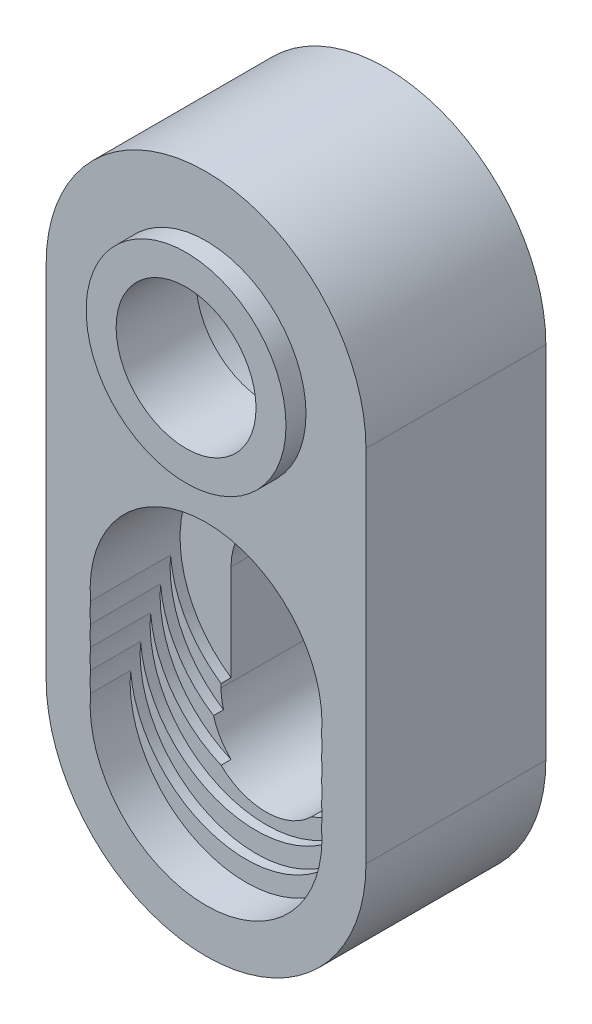
ISO-10303-21;
HEADER;
FILE_DESCRIPTION(('STEP AP214'),'2;1');
FILE_NAME('part.step','',(''),(''),'','','');
FILE_SCHEMA(('AUTOMOTIVE_DESIGN { 1 0 10303 214 1 1 1 1 }'));
ENDSEC;
DATA;
#1=APPLICATION_CONTEXT('core data for automotive mechanical design processes');
#2=APPLICATION_PROTOCOL_DEFINITION('international standard','automotive_design',2000,#1);
#3=PRODUCT_CONTEXT('',#1,'mechanical');
#4=PRODUCT('Part','Part','',(#3));
#5=PRODUCT_RELATED_PRODUCT_CATEGORY('part','',(#4));
#6=PRODUCT_DEFINITION_FORMATION('','',#4);
#7=PRODUCT_DEFINITION_CONTEXT('part definition',#1,'design');
#8=PRODUCT_DEFINITION('design','',#6,#7);
#9=PRODUCT_DEFINITION_SHAPE('','',#8);
#10=(LENGTH_UNIT() NAMED_UNIT(*) SI_UNIT(.MILLI.,.METRE.));
#11=(NAMED_UNIT(*) PLANE_ANGLE_UNIT() SI_UNIT($,.RADIAN.));
#12=(NAMED_UNIT(*) SI_UNIT($,.STERADIAN.) SOLID_ANGLE_UNIT());
#13=UNCERTAINTY_MEASURE_WITH_UNIT(LENGTH_MEASURE(1.E-05),#10,'distance_accuracy_value','');
#14=(GEOMETRIC_REPRESENTATION_CONTEXT(3) GLOBAL_UNCERTAINTY_ASSIGNED_CONTEXT((#13)) GLOBAL_UNIT_ASSIGNED_CONTEXT((#10,
#11,#12)) REPRESENTATION_CONTEXT('',''));
#15=CARTESIAN_POINT('',(0.,0.,0.));
#16=DIRECTION('',(0.,0.,1.));
#17=DIRECTION('',(1.,0.,0.));
#18=AXIS2_PLACEMENT_3D('',#15,#16,#17);
#19=CARTESIAN_POINT('',(0.,0.,4.5));
#20=DIRECTION('',(0.,0.,-1.));
#21=DIRECTION('',(-1.,0.,0.));
#22=AXIS2_PLACEMENT_3D('',#19,#20,#21);
#23=CYLINDRICAL_SURFACE('',#22,1.75);
#24=CARTESIAN_POINT('',(0.,0.,5.));
#25=DIRECTION('',(0.,0.,1.));
#26=DIRECTION('',(1.,0.,0.));
#27=AXIS2_PLACEMENT_3D('',#24,#25,#26);
#28=CIRCLE('',#27,1.75);
#29=CARTESIAN_POINT('',(1.75,0.,5.));
#30=VERTEX_POINT('',#29);
#31=EDGE_CURVE('E345',#30,#30,#28,.T.);
#32=ORIENTED_EDGE('',*,*,#31,.T.);
#33=EDGE_LOOP('',(#32));
#34=FACE_BOUND('',#33,.T.);
#35=CARTESIAN_POINT('',(0.,0.,3.));
#36=DIRECTION('',(0.,0.,-1.));
#37=DIRECTION('',(-1.,0.,0.));
#38=AXIS2_PLACEMENT_3D('',#35,#36,#37);
#39=CIRCLE('',#38,1.75);
#40=CARTESIAN_POINT('',(-1.75,0.,3.));
#41=VERTEX_POINT('',#40);
#42=EDGE_CURVE('E46',#41,#41,#39,.T.);
#43=ORIENTED_EDGE('',*,*,#42,.T.);
#44=EDGE_LOOP('',(#43));
#45=FACE_BOUND('',#44,.T.);
#46=ADVANCED_FACE('F42',(#34,#45),#23,.F.);
#47=CARTESIAN_POINT('',(0.,-6.5,0.));
#48=DIRECTION('',(0.,0.,1.));
#49=DIRECTION('',(1.,0.,0.));
#50=AXIS2_PLACEMENT_3D('',#47,#48,#49);
#51=CYLINDRICAL_SURFACE('',#50,1.625);
#52=CARTESIAN_POINT('',(0.,-6.5,2.25));
#53=DIRECTION('',(0.,0.,1.));
#54=DIRECTION('',(1.,0.,0.));
#55=AXIS2_PLACEMENT_3D('',#52,#53,#54);
#56=CIRCLE('',#55,1.625);
#57=CARTESIAN_POINT('',(-1.625,-6.5,2.25));
#58=VERTEX_POINT('',#57);
#59=CARTESIAN_POINT('',(1.625,-6.5,2.25));
#60=VERTEX_POINT('',#59);
#61=EDGE_CURVE('E11',#58,#60,#56,.F.);
#62=ORIENTED_EDGE('',*,*,#61,.F.);
#63=DIRECTION('',(0.,0.,1.));
#64=VECTOR('',#63,1.);
#65=CARTESIAN_POINT('',(-1.625,-6.5,0.));
#66=LINE('',#65,#64);
#67=CARTESIAN_POINT('',(-1.625,-6.5,0.));
#68=VERTEX_POINT('',#67);
#69=EDGE_CURVE('E340',#68,#58,#66,.T.);
#70=ORIENTED_EDGE('',*,*,#69,.F.);
#71=CARTESIAN_POINT('',(0.,-6.5,0.));
#72=DIRECTION('',(0.,0.,1.));
#73=DIRECTION('',(1.,0.,0.));
#74=AXIS2_PLACEMENT_3D('',#71,#72,#73);
#75=CIRCLE('',#74,1.625);
#76=CARTESIAN_POINT('',(1.625,-6.5,0.));
#77=VERTEX_POINT('',#76);
#78=EDGE_CURVE('E321',#77,#68,#75,.T.);
#79=ORIENTED_EDGE('',*,*,#78,.F.);
#80=DIRECTION('',(0.,0.,1.));
#81=VECTOR('',#80,1.);
#82=CARTESIAN_POINT('',(1.625,-6.5,0.));
#83=LINE('',#82,#81);
#84=EDGE_CURVE('E341',#77,#60,#83,.T.);
#85=ORIENTED_EDGE('',*,*,#84,.T.);
#86=EDGE_LOOP('',(#62,#70,#79,#85));
#87=FACE_BOUND('',#86,.T.);
#88=ADVANCED_FACE('F464',(#87),#51,.F.);
#89=CARTESIAN_POINT('',(0.,-7.,2.5));
#90=DIRECTION('',(0.,0.,1.));
#91=DIRECTION('',(1.,0.,0.));
#92=AXIS2_PLACEMENT_3D('',#89,#90,#91);
#93=PLANE('',#92);
#94=CARTESIAN_POINT('',(0.,-6.5,2.5));
#95=DIRECTION('',(0.,0.,1.));
#96=DIRECTION('',(1.,0.,0.));
#97=AXIS2_PLACEMENT_3D('',#94,#95,#96);
#98=CIRCLE('',#97,2.9);
#99=CARTESIAN_POINT('',(-2.88920404263873,-6.75,2.5));
#100=VERTEX_POINT('',#99);
#101=CARTESIAN_POINT('',(-1.625,-8.9019523309175,2.5));
#102=VERTEX_POINT('',#101);
#103=EDGE_CURVE('E475',#100,#102,#98,.T.);
#104=ORIENTED_EDGE('',*,*,#103,.F.);
#105=CARTESIAN_POINT('',(0.,-7.,2.5));
#106=DIRECTION('',(0.,0.,1.));
#107=DIRECTION('',(1.,0.,0.));
#108=AXIS2_PLACEMENT_3D('',#105,#106,#107);
#109=CIRCLE('',#108,2.9);
#110=CARTESIAN_POINT('',(-1.56363582935284,-9.44234375,2.5));
#111=VERTEX_POINT('',#110);
#112=EDGE_CURVE('E221',#100,#111,#109,.T.);
#113=ORIENTED_EDGE('',*,*,#112,.T.);
#114=CARTESIAN_POINT('',(0.,-9.,2.5));
#115=DIRECTION('',(0.,0.,1.));
#116=DIRECTION('',(1.,0.,0.));
#117=AXIS2_PLACEMENT_3D('',#114,#115,#116);
#118=CIRCLE('',#117,1.625);
#119=CARTESIAN_POINT('',(-1.625,-9.,2.5));
#120=VERTEX_POINT('',#119);
#121=EDGE_CURVE('E438',#111,#120,#118,.F.);
#122=ORIENTED_EDGE('',*,*,#121,.T.);
#123=DIRECTION('',(0.,1.,0.));
#124=VECTOR('',#123,1.);
#125=CARTESIAN_POINT('',(-1.625,-6.5,2.5));
#126=LINE('',#125,#124);
#127=EDGE_CURVE('E254',#120,#102,#126,.T.);
#128=ORIENTED_EDGE('',*,*,#127,.T.);
#129=EDGE_LOOP('',(#104,#113,#122,#128));
#130=FACE_BOUND('',#129,.T.);
#131=ADVANCED_FACE('F446',(#130),#93,.T.);
#132=CARTESIAN_POINT('',(0.,-7.,2.5));
#133=DIRECTION('',(0.,0.,1.));
#134=DIRECTION('',(1.,0.,0.));
#135=AXIS2_PLACEMENT_3D('',#132,#133,#134);
#136=CYLINDRICAL_SURFACE('',#135,2.9);
#137=ORIENTED_EDGE('',*,*,#112,.F.);
#138=DIRECTION('',(0.,0.,1.));
#139=VECTOR('',#138,1.);
#140=CARTESIAN_POINT('',(-2.88920404263873,-6.75,3.375));
#141=LINE('',#140,#139);
#142=CARTESIAN_POINT('',(-2.88920404263873,-6.75,4.5));
#143=VERTEX_POINT('',#142);
#144=EDGE_CURVE('E52',#100,#143,#141,.T.);
#145=ORIENTED_EDGE('',*,*,#144,.T.);
#146=CARTESIAN_POINT('',(0.,-7.,4.5));
#147=DIRECTION('',(0.,0.,1.));
#148=DIRECTION('',(1.,0.,0.));
#149=AXIS2_PLACEMENT_3D('',#146,#147,#148);
#150=CIRCLE('',#149,2.9);
#151=CARTESIAN_POINT('',(-2.88920404263873,-7.25,4.5));
#152=VERTEX_POINT('',#151);
#153=EDGE_CURVE('E218',#143,#152,#150,.T.);
#154=ORIENTED_EDGE('',*,*,#153,.T.);
#155=DIRECTION('',(0.,0.,1.));
#156=VECTOR('',#155,1.);
#157=CARTESIAN_POINT('',(-2.88920404263873,-7.25,3.5));
#158=LINE('',#157,#156);
#159=CARTESIAN_POINT('',(-2.88920404263873,-7.25,2.75));
#160=VERTEX_POINT('',#159);
#161=EDGE_CURVE('E432',#160,#152,#158,.T.);
#162=ORIENTED_EDGE('',*,*,#161,.F.);
#163=CARTESIAN_POINT('',(0.,-7.,2.75));
#164=DIRECTION('',(0.,0.,1.));
#165=DIRECTION('',(1.,0.,0.));
#166=AXIS2_PLACEMENT_3D('',#163,#164,#165);
#167=CIRCLE('',#166,2.9);
#168=CARTESIAN_POINT('',(-1.56363582935284,-9.44234375,2.75));
#169=VERTEX_POINT('',#168);
#170=EDGE_CURVE('E243',#160,#169,#167,.T.);
#171=ORIENTED_EDGE('',*,*,#170,.T.);
#172=DIRECTION('',(0.,0.,1.));
#173=VECTOR('',#172,1.);
#174=CARTESIAN_POINT('',(-1.56363582935284,-9.44234375,3.5));
#175=LINE('',#174,#173);
#176=EDGE_CURVE('E247',#111,#169,#175,.T.);
#177=ORIENTED_EDGE('',*,*,#176,.F.);
#178=EDGE_LOOP('',(#137,#145,#154,#162,#171,#177));
#179=FACE_BOUND('',#178,.T.);
#180=ADVANCED_FACE('F217',(#179),#136,.F.);
#181=CARTESIAN_POINT('',(1.625,-6.5,0.));
#182=DIRECTION('',(1.,0.,0.));
#183=DIRECTION('',(0.,1.,0.));
#184=AXIS2_PLACEMENT_3D('',#181,#182,#183);
#185=PLANE('',#184);
#186=DIRECTION('',(0.,-1.,0.));
#187=VECTOR('',#186,1.);
#188=CARTESIAN_POINT('',(1.625,-6.5,2.5));
#189=LINE('',#188,#187);
#190=CARTESIAN_POINT('',(1.625,-8.90195233091749,2.5));
#191=VERTEX_POINT('',#190);
#192=CARTESIAN_POINT('',(1.625,-9.,2.5));
#193=VERTEX_POINT('',#192);
#194=EDGE_CURVE('E251',#191,#193,#189,.T.);
#195=ORIENTED_EDGE('',*,*,#194,.F.);
#196=DIRECTION('',(0.,0.,1.));
#197=VECTOR('',#196,1.);
#198=CARTESIAN_POINT('',(1.625,-8.90195233091749,2.25));
#199=LINE('',#198,#197);
#200=CARTESIAN_POINT('',(1.625,-8.90195233091749,2.25));
#201=VERTEX_POINT('',#200);
#202=EDGE_CURVE('E473',#191,#201,#199,.F.);
#203=ORIENTED_EDGE('',*,*,#202,.T.);
#204=DIRECTION('',(0.,-1.,0.));
#205=VECTOR('',#204,1.);
#206=CARTESIAN_POINT('',(1.625,-6.5,2.25));
#207=LINE('',#206,#205);
#208=EDGE_CURVE('E231',#60,#201,#207,.T.);
#209=ORIENTED_EDGE('',*,*,#208,.F.);
#210=ORIENTED_EDGE('',*,*,#84,.F.);
#211=DIRECTION('',(0.,1.,0.));
#212=VECTOR('',#211,1.);
#213=CARTESIAN_POINT('',(1.625,-6.5,0.));
#214=LINE('',#213,#212);
#215=CARTESIAN_POINT('',(1.625,-9.,0.));
#216=VERTEX_POINT('',#215);
#217=EDGE_CURVE('E336',#216,#77,#214,.T.);
#218=ORIENTED_EDGE('',*,*,#217,.F.);
#219=DIRECTION('',(0.,0.,1.));
#220=VECTOR('',#219,1.);
#221=CARTESIAN_POINT('',(1.625,-9.,0.));
#222=LINE('',#221,#220);
#223=EDGE_CURVE('E346',#216,#193,#222,.T.);
#224=ORIENTED_EDGE('',*,*,#223,.T.);
#225=EDGE_LOOP('',(#195,#203,#209,#210,#218,#224));
#226=FACE_BOUND('',#225,.T.);
#227=ADVANCED_FACE('F472',(#226),#185,.F.);
#228=CARTESIAN_POINT('',(-1.625,-6.5,0.));
#229=DIRECTION('',(-1.,0.,0.));
#230=DIRECTION('',(0.,0.,1.));
#231=AXIS2_PLACEMENT_3D('',#228,#229,#230);
#232=PLANE('',#231);
#233=DIRECTION('',(0.,1.,0.));
#234=VECTOR('',#233,1.);
#235=CARTESIAN_POINT('',(-1.625,-6.5,2.25));
#236=LINE('',#235,#234);
#237=CARTESIAN_POINT('',(-1.625,-8.9019523309175,2.25));
#238=VERTEX_POINT('',#237);
#239=EDGE_CURVE('E235',#238,#58,#236,.T.);
#240=ORIENTED_EDGE('',*,*,#239,.F.);
#241=DIRECTION('',(0.,0.,1.));
#242=VECTOR('',#241,1.);
#243=CARTESIAN_POINT('',(-1.625,-8.9019523309175,2.25));
#244=LINE('',#243,#242);
#245=EDGE_CURVE('E454',#238,#102,#244,.T.);
#246=ORIENTED_EDGE('',*,*,#245,.T.);
#247=ORIENTED_EDGE('',*,*,#127,.F.);
#248=DIRECTION('',(0.,0.,1.));
#249=VECTOR('',#248,1.);
#250=CARTESIAN_POINT('',(-1.625,-9.,0.));
#251=LINE('',#250,#249);
#252=CARTESIAN_POINT('',(-1.625,-9.,0.));
#253=VERTEX_POINT('',#252);
#254=EDGE_CURVE('E350',#253,#120,#251,.T.);
#255=ORIENTED_EDGE('',*,*,#254,.F.);
#256=DIRECTION('',(0.,-1.,0.));
#257=VECTOR('',#256,1.);
#258=CARTESIAN_POINT('',(-1.625,-6.5,0.));
#259=LINE('',#258,#257);
#260=EDGE_CURVE('E328',#68,#253,#259,.T.);
#261=ORIENTED_EDGE('',*,*,#260,.F.);
#262=ORIENTED_EDGE('',*,*,#69,.T.);
#263=EDGE_LOOP('',(#240,#246,#247,#255,#261,#262));
#264=FACE_BOUND('',#263,.T.);
#265=ADVANCED_FACE('F452',(#264),#232,.F.);
#266=CARTESIAN_POINT('',(0.,-7.5,2.75));
#267=DIRECTION('',(0.,0.,1.));
#268=DIRECTION('',(1.,0.,0.));
#269=AXIS2_PLACEMENT_3D('',#266,#267,#268);
#270=PLANE('',#269);
#271=ORIENTED_EDGE('',*,*,#170,.F.);
#272=CARTESIAN_POINT('',(0.,-7.5,2.75));
#273=DIRECTION('',(0.,0.,1.));
#274=DIRECTION('',(1.,0.,0.));
#275=AXIS2_PLACEMENT_3D('',#272,#273,#274);
#276=CIRCLE('',#275,2.9);
#277=CARTESIAN_POINT('',(-1.12445663961533,-10.173125,2.75));
#278=VERTEX_POINT('',#277);
#279=EDGE_CURVE('E263',#160,#278,#276,.T.);
#280=ORIENTED_EDGE('',*,*,#279,.T.);
#281=CARTESIAN_POINT('',(0.,-9.,2.75));
#282=DIRECTION('',(0.,0.,1.));
#283=DIRECTION('',(1.,0.,0.));
#284=AXIS2_PLACEMENT_3D('',#281,#282,#283);
#285=CIRCLE('',#284,1.625);
#286=EDGE_CURVE('E282',#278,#169,#285,.F.);
#287=ORIENTED_EDGE('',*,*,#286,.T.);
#288=EDGE_LOOP('',(#271,#280,#287));
#289=FACE_BOUND('',#288,.T.);
#290=ADVANCED_FACE('F575',(#289),#270,.T.);
#291=CARTESIAN_POINT('',(0.,-7.5,2.75));
#292=DIRECTION('',(0.,0.,1.));
#293=DIRECTION('',(1.,0.,0.));
#294=AXIS2_PLACEMENT_3D('',#291,#292,#293);
#295=CYLINDRICAL_SURFACE('',#294,2.9);
#296=ORIENTED_EDGE('',*,*,#279,.F.);
#297=ORIENTED_EDGE('',*,*,#161,.T.);
#298=CARTESIAN_POINT('',(0.,-7.5,4.5));
#299=DIRECTION('',(0.,0.,1.));
#300=DIRECTION('',(1.,0.,0.));
#301=AXIS2_PLACEMENT_3D('',#298,#299,#300);
#302=CIRCLE('',#301,2.9);
#303=CARTESIAN_POINT('',(-2.88920404263873,-7.75,4.5));
#304=VERTEX_POINT('',#303);
#305=EDGE_CURVE('E228',#152,#304,#302,.T.);
#306=ORIENTED_EDGE('',*,*,#305,.T.);
#307=DIRECTION('',(0.,0.,1.));
#308=VECTOR('',#307,1.);
#309=CARTESIAN_POINT('',(-2.88920404263873,-7.75,3.625));
#310=LINE('',#309,#308);
#311=CARTESIAN_POINT('',(-2.88920404263873,-7.75,3.));
#312=VERTEX_POINT('',#311);
#313=EDGE_CURVE('E425',#312,#304,#310,.T.);
#314=ORIENTED_EDGE('',*,*,#313,.F.);
#315=CARTESIAN_POINT('',(0.,-7.5,3.));
#316=DIRECTION('',(0.,0.,1.));
#317=DIRECTION('',(1.,0.,0.));
#318=AXIS2_PLACEMENT_3D('',#315,#316,#317);
#319=CIRCLE('',#318,2.9);
#320=CARTESIAN_POINT('',(-1.12445663961533,-10.173125,3.));
#321=VERTEX_POINT('',#320);
#322=EDGE_CURVE('E271',#312,#321,#319,.T.);
#323=ORIENTED_EDGE('',*,*,#322,.T.);
#324=DIRECTION('',(0.,0.,1.));
#325=VECTOR('',#324,1.);
#326=CARTESIAN_POINT('',(-1.12445663961533,-10.173125,3.625));
#327=LINE('',#326,#325);
#328=EDGE_CURVE('E275',#278,#321,#327,.T.);
#329=ORIENTED_EDGE('',*,*,#328,.F.);
#330=EDGE_LOOP('',(#296,#297,#306,#314,#323,#329));
#331=FACE_BOUND('',#330,.T.);
#332=ADVANCED_FACE('F578',(#331),#295,.F.);
#333=CARTESIAN_POINT('',(0.,-9.,0.));
#334=DIRECTION('',(0.,0.,1.));
#335=DIRECTION('',(1.,0.,0.));
#336=AXIS2_PLACEMENT_3D('',#333,#334,#335);
#337=CYLINDRICAL_SURFACE('',#336,1.625);
#338=ORIENTED_EDGE('',*,*,#121,.F.);
#339=ORIENTED_EDGE('',*,*,#176,.T.);
#340=ORIENTED_EDGE('',*,*,#286,.F.);
#341=ORIENTED_EDGE('',*,*,#328,.T.);
#342=CARTESIAN_POINT('',(0.,-9.,3.));
#343=DIRECTION('',(0.,0.,1.));
#344=DIRECTION('',(1.,0.,0.));
#345=AXIS2_PLACEMENT_3D('',#342,#343,#344);
#346=CIRCLE('',#345,1.625);
#347=CARTESIAN_POINT('',(1.12445663961534,-10.173125,3.));
#348=VERTEX_POINT('',#347);
#349=EDGE_CURVE('E295',#348,#321,#346,.F.);
#350=ORIENTED_EDGE('',*,*,#349,.F.);
#351=DIRECTION('',(0.,0.,1.));
#352=VECTOR('',#351,1.);
#353=CARTESIAN_POINT('',(1.12445663961533,-10.173125,3.625));
#354=LINE('',#353,#352);
#355=CARTESIAN_POINT('',(1.12445663961534,-10.173125,2.75));
#356=VERTEX_POINT('',#355);
#357=EDGE_CURVE('E270',#348,#356,#354,.F.);
#358=ORIENTED_EDGE('',*,*,#357,.T.);
#359=CARTESIAN_POINT('',(1.56363582935284,-9.44234375,2.75));
#360=VERTEX_POINT('',#359);
#361=EDGE_CURVE('E279',#360,#356,#285,.F.);
#362=ORIENTED_EDGE('',*,*,#361,.F.);
#363=DIRECTION('',(0.,0.,1.));
#364=VECTOR('',#363,1.);
#365=CARTESIAN_POINT('',(1.56363582935284,-9.44234375,3.5));
#366=LINE('',#365,#364);
#367=CARTESIAN_POINT('',(1.56363582935284,-9.44234375,2.5));
#368=VERTEX_POINT('',#367);
#369=EDGE_CURVE('E242',#360,#368,#366,.F.);
#370=ORIENTED_EDGE('',*,*,#369,.T.);
#371=EDGE_CURVE('E435',#193,#368,#118,.F.);
#372=ORIENTED_EDGE('',*,*,#371,.F.);
#373=ORIENTED_EDGE('',*,*,#223,.F.);
#374=CARTESIAN_POINT('',(0.,-9.,0.));
#375=DIRECTION('',(0.,0.,1.));
#376=DIRECTION('',(1.,0.,0.));
#377=AXIS2_PLACEMENT_3D('',#374,#375,#376);
#378=CIRCLE('',#377,1.625);
#379=EDGE_CURVE('E332',#253,#216,#378,.T.);
#380=ORIENTED_EDGE('',*,*,#379,.F.);
#381=ORIENTED_EDGE('',*,*,#254,.T.);
#382=EDGE_LOOP('',(#338,#339,#340,#341,#350,#358,#362,#370,#372,#373,#380,#381));
#383=FACE_BOUND('',#382,.T.);
#384=ADVANCED_FACE('F455',(#383),#337,.F.);
#385=CARTESIAN_POINT('',(0.,0.,4.5));
#386=DIRECTION('',(0.,0.,1.));
#387=DIRECTION('',(1.,0.,0.));
#388=AXIS2_PLACEMENT_3D('',#385,#386,#387);
#389=PLANE('',#388);
#390=CARTESIAN_POINT('',(0.,-6.5,4.5));
#391=DIRECTION('',(0.,0.,1.));
#392=DIRECTION('',(1.,0.,0.));
#393=AXIS2_PLACEMENT_3D('',#390,#391,#392);
#394=CIRCLE('',#393,2.9);
#395=CARTESIAN_POINT('',(2.88920404263873,-6.75,4.5));
#396=VERTEX_POINT('',#395);
#397=EDGE_CURVE('E202',#396,#143,#394,.T.);
#398=ORIENTED_EDGE('',*,*,#397,.F.);
#399=CARTESIAN_POINT('',(2.88920404263873,-7.25,4.5));
#400=VERTEX_POINT('',#399);
#401=EDGE_CURVE('E230',#400,#396,#150,.T.);
#402=ORIENTED_EDGE('',*,*,#401,.F.);
#403=CARTESIAN_POINT('',(2.88920404263873,-7.75,4.5));
#404=VERTEX_POINT('',#403);
#405=EDGE_CURVE('E264',#404,#400,#302,.T.);
#406=ORIENTED_EDGE('',*,*,#405,.F.);
#407=CARTESIAN_POINT('',(0.,-8.,4.5));
#408=DIRECTION('',(0.,0.,1.));
#409=DIRECTION('',(1.,0.,0.));
#410=AXIS2_PLACEMENT_3D('',#407,#408,#409);
#411=CIRCLE('',#410,2.9);
#412=CARTESIAN_POINT('',(2.88920404263873,-8.25,4.5));
#413=VERTEX_POINT('',#412);
#414=EDGE_CURVE('E289',#413,#404,#411,.T.);
#415=ORIENTED_EDGE('',*,*,#414,.F.);
#416=CARTESIAN_POINT('',(0.,-8.5,4.5));
#417=DIRECTION('',(0.,0.,1.));
#418=DIRECTION('',(1.,0.,0.));
#419=AXIS2_PLACEMENT_3D('',#416,#417,#418);
#420=CIRCLE('',#419,2.9);
#421=CARTESIAN_POINT('',(2.88920404263873,-8.74999999999999,4.5));
#422=VERTEX_POINT('',#421);
#423=EDGE_CURVE('E299',#422,#413,#420,.T.);
#424=ORIENTED_EDGE('',*,*,#423,.F.);
#425=CARTESIAN_POINT('',(0.,-9.,4.5));
#426=DIRECTION('',(0.,0.,1.));
#427=DIRECTION('',(1.,0.,0.));
#428=AXIS2_PLACEMENT_3D('',#425,#426,#427);
#429=CIRCLE('',#428,2.9);
#430=CARTESIAN_POINT('',(-2.88920404263873,-8.75000000000001,4.5));
#431=VERTEX_POINT('',#430);
#432=EDGE_CURVE('E316',#431,#422,#429,.T.);
#433=ORIENTED_EDGE('',*,*,#432,.F.);
#434=CARTESIAN_POINT('',(-2.88920404263873,-8.25,4.5));
#435=VERTEX_POINT('',#434);
#436=EDGE_CURVE('E305',#435,#431,#420,.T.);
#437=ORIENTED_EDGE('',*,*,#436,.F.);
#438=EDGE_CURVE('E288',#304,#435,#411,.T.);
#439=ORIENTED_EDGE('',*,*,#438,.F.);
#440=ORIENTED_EDGE('',*,*,#305,.F.);
#441=ORIENTED_EDGE('',*,*,#153,.F.);
#442=EDGE_LOOP('',(#398,#402,#406,#415,#424,#433,#437,#439,#440,#441));
#443=FACE_BOUND('',#442,.T.);
#444=CARTESIAN_POINT('',(0.,0.,4.5));
#445=DIRECTION('',(0.,0.,1.));
#446=DIRECTION('',(1.,0.,0.));
#447=AXIS2_PLACEMENT_3D('',#444,#445,#446);
#448=CIRCLE('',#447,4.);
#449=CARTESIAN_POINT('',(4.,0.,4.5));
#450=VERTEX_POINT('',#449);
#451=CARTESIAN_POINT('',(-4.,0.,4.5));
#452=VERTEX_POINT('',#451);
#453=EDGE_CURVE('E369',#450,#452,#448,.T.);
#454=ORIENTED_EDGE('',*,*,#453,.T.);
#455=DIRECTION('',(0.,-1.,0.));
#456=VECTOR('',#455,1.);
#457=CARTESIAN_POINT('',(-4.,0.,4.5));
#458=LINE('',#457,#456);
#459=CARTESIAN_POINT('',(-4.,-9.,4.5));
#460=VERTEX_POINT('',#459);
#461=EDGE_CURVE('E373',#452,#460,#458,.T.);
#462=ORIENTED_EDGE('',*,*,#461,.T.);
#463=CARTESIAN_POINT('',(0.,-9.,4.5));
#464=DIRECTION('',(0.,0.,1.));
#465=DIRECTION('',(1.,0.,0.));
#466=AXIS2_PLACEMENT_3D('',#463,#464,#465);
#467=CIRCLE('',#466,4.);
#468=CARTESIAN_POINT('',(4.,-9.,4.5));
#469=VERTEX_POINT('',#468);
#470=EDGE_CURVE('E377',#460,#469,#467,.T.);
#471=ORIENTED_EDGE('',*,*,#470,.T.);
#472=DIRECTION('',(0.,1.,0.));
#473=VECTOR('',#472,1.);
#474=CARTESIAN_POINT('',(4.,0.,4.5));
#475=LINE('',#474,#473);
#476=EDGE_CURVE('E380',#469,#450,#475,.T.);
#477=ORIENTED_EDGE('',*,*,#476,.T.);
#478=EDGE_LOOP('',(#454,#462,#471,#477));
#479=FACE_BOUND('',#478,.T.);
#480=CARTESIAN_POINT('',(0.,0.,4.5));
#481=DIRECTION('',(0.,0.,1.));
#482=DIRECTION('',(1.,0.,0.));
#483=AXIS2_PLACEMENT_3D('',#480,#481,#482);
#484=CIRCLE('',#483,2.5);
#485=CARTESIAN_POINT('',(2.5,0.,4.5));
#486=VERTEX_POINT('',#485);
#487=EDGE_CURVE('E360',#486,#486,#484,.T.);
#488=ORIENTED_EDGE('',*,*,#487,.F.);
#489=EDGE_LOOP('',(#488));
#490=FACE_BOUND('',#489,.T.);
#491=ADVANCED_FACE('F225',(#443,#479,#490),#389,.T.);
#492=CARTESIAN_POINT('',(0.,0.,0.));
#493=DIRECTION('',(0.,0.,1.));
#494=DIRECTION('',(1.,0.,0.));
#495=AXIS2_PLACEMENT_3D('',#492,#493,#494);
#496=PLANE('',#495);
#497=CARTESIAN_POINT('',(0.,0.,0.));
#498=DIRECTION('',(0.,0.,-1.));
#499=DIRECTION('',(-1.,0.,0.));
#500=AXIS2_PLACEMENT_3D('',#497,#498,#499);
#501=CIRCLE('',#500,2.9);
#502=CARTESIAN_POINT('',(-2.9,0.,0.));
#503=VERTEX_POINT('',#502);
#504=EDGE_CURVE('E487',#503,#503,#501,.T.);
#505=ORIENTED_EDGE('',*,*,#504,.F.);
#506=EDGE_LOOP('',(#505));
#507=FACE_BOUND('',#506,.T.);
#508=ORIENTED_EDGE('',*,*,#217,.T.);
#509=ORIENTED_EDGE('',*,*,#78,.T.);
#510=ORIENTED_EDGE('',*,*,#260,.T.);
#511=ORIENTED_EDGE('',*,*,#379,.T.);
#512=EDGE_LOOP('',(#508,#509,#510,#511));
#513=FACE_BOUND('',#512,.T.);
#514=CARTESIAN_POINT('',(0.,0.,0.));
#515=DIRECTION('',(0.,0.,1.));
#516=DIRECTION('',(1.,0.,0.));
#517=AXIS2_PLACEMENT_3D('',#514,#515,#516);
#518=CIRCLE('',#517,4.);
#519=CARTESIAN_POINT('',(4.,0.,0.));
#520=VERTEX_POINT('',#519);
#521=CARTESIAN_POINT('',(-4.,0.,0.));
#522=VERTEX_POINT('',#521);
#523=EDGE_CURVE('E365',#520,#522,#518,.T.);
#524=ORIENTED_EDGE('',*,*,#523,.F.);
#525=DIRECTION('',(0.,1.,0.));
#526=VECTOR('',#525,1.);
#527=CARTESIAN_POINT('',(4.,0.,0.));
#528=LINE('',#527,#526);
#529=CARTESIAN_POINT('',(4.,-9.,0.));
#530=VERTEX_POINT('',#529);
#531=EDGE_CURVE('E374',#530,#520,#528,.T.);
#532=ORIENTED_EDGE('',*,*,#531,.F.);
#533=CARTESIAN_POINT('',(0.,-9.,0.));
#534=DIRECTION('',(0.,0.,1.));
#535=DIRECTION('',(1.,0.,0.));
#536=AXIS2_PLACEMENT_3D('',#533,#534,#535);
#537=CIRCLE('',#536,4.);
#538=CARTESIAN_POINT('',(-4.,-9.,0.));
#539=VERTEX_POINT('',#538);
#540=EDGE_CURVE('E390',#539,#530,#537,.T.);
#541=ORIENTED_EDGE('',*,*,#540,.F.);
#542=DIRECTION('',(0.,-1.,0.));
#543=VECTOR('',#542,1.);
#544=CARTESIAN_POINT('',(-4.,0.,0.));
#545=LINE('',#544,#543);
#546=EDGE_CURVE('E387',#522,#539,#545,.T.);
#547=ORIENTED_EDGE('',*,*,#546,.F.);
#548=EDGE_LOOP('',(#524,#532,#541,#547));
#549=FACE_BOUND('',#548,.T.);
#550=ADVANCED_FACE('F459',(#507,#513,#549),#496,.F.);
#551=CARTESIAN_POINT('',(0.,0.,4.5));
#552=DIRECTION('',(0.,0.,-1.));
#553=DIRECTION('',(-1.,0.,0.));
#554=AXIS2_PLACEMENT_3D('',#551,#552,#553);
#555=CYLINDRICAL_SURFACE('',#554,4.);
#556=ORIENTED_EDGE('',*,*,#523,.T.);
#557=DIRECTION('',(0.,0.,-1.));
#558=VECTOR('',#557,1.);
#559=CARTESIAN_POINT('',(-4.,0.,4.5));
#560=LINE('',#559,#558);
#561=EDGE_CURVE('E406',#452,#522,#560,.T.);
#562=ORIENTED_EDGE('',*,*,#561,.F.);
#563=ORIENTED_EDGE('',*,*,#453,.F.);
#564=DIRECTION('',(0.,0.,-1.));
#565=VECTOR('',#564,1.);
#566=CARTESIAN_POINT('',(4.,0.,4.5));
#567=LINE('',#566,#565);
#568=EDGE_CURVE('E383',#450,#520,#567,.T.);
#569=ORIENTED_EDGE('',*,*,#568,.T.);
#570=EDGE_LOOP('',(#556,#562,#563,#569));
#571=FACE_BOUND('',#570,.T.);
#572=ADVANCED_FACE('F44',(#571),#555,.T.);
#573=CARTESIAN_POINT('',(-4.,0.,4.5));
#574=DIRECTION('',(1.,0.,0.));
#575=DIRECTION('',(0.,1.,0.));
#576=AXIS2_PLACEMENT_3D('',#573,#574,#575);
#577=PLANE('',#576);
#578=ORIENTED_EDGE('',*,*,#546,.T.);
#579=DIRECTION('',(0.,0.,-1.));
#580=VECTOR('',#579,1.);
#581=CARTESIAN_POINT('',(-4.,-9.,4.5));
#582=LINE('',#581,#580);
#583=EDGE_CURVE('E402',#460,#539,#582,.T.);
#584=ORIENTED_EDGE('',*,*,#583,.F.);
#585=ORIENTED_EDGE('',*,*,#461,.F.);
#586=ORIENTED_EDGE('',*,*,#561,.T.);
#587=EDGE_LOOP('',(#578,#584,#585,#586));
#588=FACE_BOUND('',#587,.T.);
#589=ADVANCED_FACE('F534',(#588),#577,.F.);
#590=CARTESIAN_POINT('',(0.,-9.,4.5));
#591=DIRECTION('',(0.,0.,-1.));
#592=DIRECTION('',(-1.,0.,0.));
#593=AXIS2_PLACEMENT_3D('',#590,#591,#592);
#594=CYLINDRICAL_SURFACE('',#593,4.);
#595=ORIENTED_EDGE('',*,*,#540,.T.);
#596=DIRECTION('',(0.,0.,-1.));
#597=VECTOR('',#596,1.);
#598=CARTESIAN_POINT('',(4.,-9.,4.5));
#599=LINE('',#598,#597);
#600=EDGE_CURVE('E398',#469,#530,#599,.T.);
#601=ORIENTED_EDGE('',*,*,#600,.F.);
#602=ORIENTED_EDGE('',*,*,#470,.F.);
#603=ORIENTED_EDGE('',*,*,#583,.T.);
#604=EDGE_LOOP('',(#595,#601,#602,#603));
#605=FACE_BOUND('',#604,.T.);
#606=ADVANCED_FACE('F531',(#605),#594,.T.);
#607=CARTESIAN_POINT('',(4.,0.,4.5));
#608=DIRECTION('',(-1.,0.,0.));
#609=DIRECTION('',(0.,-1.,0.));
#610=AXIS2_PLACEMENT_3D('',#607,#608,#609);
#611=PLANE('',#610);
#612=ORIENTED_EDGE('',*,*,#531,.T.);
#613=ORIENTED_EDGE('',*,*,#568,.F.);
#614=ORIENTED_EDGE('',*,*,#476,.F.);
#615=ORIENTED_EDGE('',*,*,#600,.T.);
#616=EDGE_LOOP('',(#612,#613,#614,#615));
#617=FACE_BOUND('',#616,.T.);
#618=ADVANCED_FACE('F527',(#617),#611,.F.);
#619=CARTESIAN_POINT('',(0.,0.,5.));
#620=DIRECTION('',(0.,0.,1.));
#621=DIRECTION('',(1.,0.,0.));
#622=AXIS2_PLACEMENT_3D('',#619,#620,#621);
#623=PLANE('',#622);
#624=CARTESIAN_POINT('',(0.,0.,5.));
#625=DIRECTION('',(0.,0.,1.));
#626=DIRECTION('',(1.,0.,0.));
#627=AXIS2_PLACEMENT_3D('',#624,#625,#626);
#628=CIRCLE('',#627,2.5);
#629=CARTESIAN_POINT('',(2.5,0.,5.));
#630=VERTEX_POINT('',#629);
#631=EDGE_CURVE('E361',#630,#630,#628,.T.);
#632=ORIENTED_EDGE('',*,*,#631,.T.);
#633=EDGE_LOOP('',(#632));
#634=FACE_BOUND('',#633,.T.);
#635=ORIENTED_EDGE('',*,*,#31,.F.);
#636=EDGE_LOOP('',(#635));
#637=FACE_BOUND('',#636,.T.);
#638=ADVANCED_FACE('F530',(#634,#637),#623,.T.);
#639=CARTESIAN_POINT('',(0.,0.,5.));
#640=DIRECTION('',(0.,0.,-1.));
#641=DIRECTION('',(-1.,0.,0.));
#642=AXIS2_PLACEMENT_3D('',#639,#640,#641);
#643=CYLINDRICAL_SURFACE('',#642,2.5);
#644=ORIENTED_EDGE('',*,*,#631,.F.);
#645=EDGE_LOOP('',(#644));
#646=FACE_BOUND('',#645,.T.);
#647=ORIENTED_EDGE('',*,*,#487,.T.);
#648=EDGE_LOOP('',(#647));
#649=FACE_BOUND('',#648,.T.);
#650=ADVANCED_FACE('F521',(#646,#649),#643,.T.);
#651=CARTESIAN_POINT('',(0.,-9.,3.5));
#652=DIRECTION('',(0.,0.,1.));
#653=DIRECTION('',(1.,0.,0.));
#654=AXIS2_PLACEMENT_3D('',#651,#652,#653);
#655=CYLINDRICAL_SURFACE('',#654,2.9);
#656=CARTESIAN_POINT('',(0.,-9.,3.5));
#657=DIRECTION('',(0.,0.,1.));
#658=DIRECTION('',(1.,0.,0.));
#659=AXIS2_PLACEMENT_3D('',#656,#657,#658);
#660=CIRCLE('',#659,2.9);
#661=CARTESIAN_POINT('',(-2.88920404263873,-8.75000000000001,3.5));
#662=VERTEX_POINT('',#661);
#663=CARTESIAN_POINT('',(2.88920404263873,-8.74999999999999,3.5));
#664=VERTEX_POINT('',#663);
#665=EDGE_CURVE('E317',#662,#664,#660,.T.);
#666=ORIENTED_EDGE('',*,*,#665,.F.);
#667=DIRECTION('',(0.,0.,1.));
#668=VECTOR('',#667,1.);
#669=CARTESIAN_POINT('',(-2.88920404263873,-8.75000000000001,3.875));
#670=LINE('',#669,#668);
#671=EDGE_CURVE('E312',#662,#431,#670,.T.);
#672=ORIENTED_EDGE('',*,*,#671,.T.);
#673=ORIENTED_EDGE('',*,*,#432,.T.);
#674=DIRECTION('',(0.,0.,1.));
#675=VECTOR('',#674,1.);
#676=CARTESIAN_POINT('',(2.88920404263873,-8.74999999999999,3.875));
#677=LINE('',#676,#675);
#678=EDGE_CURVE('E304',#422,#664,#677,.F.);
#679=ORIENTED_EDGE('',*,*,#678,.T.);
#680=EDGE_LOOP('',(#666,#672,#673,#679));
#681=FACE_BOUND('',#680,.T.);
#682=ADVANCED_FACE('F556',(#681),#655,.F.);
#683=CARTESIAN_POINT('',(0.,-9.,3.5));
#684=DIRECTION('',(0.,0.,1.));
#685=DIRECTION('',(1.,0.,0.));
#686=AXIS2_PLACEMENT_3D('',#683,#684,#685);
#687=PLANE('',#686);
#688=CARTESIAN_POINT('',(0.,-8.5,3.5));
#689=DIRECTION('',(0.,0.,1.));
#690=DIRECTION('',(1.,0.,0.));
#691=AXIS2_PLACEMENT_3D('',#688,#689,#690);
#692=CIRCLE('',#691,2.9);
#693=EDGE_CURVE('E410',#662,#664,#692,.T.);
#694=ORIENTED_EDGE('',*,*,#693,.F.);
#695=ORIENTED_EDGE('',*,*,#665,.T.);
#696=EDGE_LOOP('',(#694,#695));
#697=FACE_BOUND('',#696,.T.);
#698=ADVANCED_FACE('F563',(#697),#687,.T.);
#699=CARTESIAN_POINT('',(0.,-8.5,3.25));
#700=DIRECTION('',(0.,0.,1.));
#701=DIRECTION('',(1.,0.,0.));
#702=AXIS2_PLACEMENT_3D('',#699,#700,#701);
#703=PLANE('',#702);
#704=CARTESIAN_POINT('',(0.,-8.,3.25));
#705=DIRECTION('',(0.,0.,1.));
#706=DIRECTION('',(1.,0.,0.));
#707=AXIS2_PLACEMENT_3D('',#704,#705,#706);
#708=CIRCLE('',#707,2.9);
#709=CARTESIAN_POINT('',(-2.88920404263873,-8.25,3.25));
#710=VERTEX_POINT('',#709);
#711=CARTESIAN_POINT('',(2.88920404263873,-8.25,3.25));
#712=VERTEX_POINT('',#711);
#713=EDGE_CURVE('E287',#710,#712,#708,.T.);
#714=ORIENTED_EDGE('',*,*,#713,.F.);
#715=CARTESIAN_POINT('',(0.,-8.5,3.25));
#716=DIRECTION('',(0.,0.,1.));
#717=DIRECTION('',(1.,0.,0.));
#718=AXIS2_PLACEMENT_3D('',#715,#716,#717);
#719=CIRCLE('',#718,2.9);
#720=EDGE_CURVE('E300',#710,#712,#719,.T.);
#721=ORIENTED_EDGE('',*,*,#720,.T.);
#722=EDGE_LOOP('',(#714,#721));
#723=FACE_BOUND('',#722,.T.);
#724=ADVANCED_FACE('F583',(#723),#703,.T.);
#725=CARTESIAN_POINT('',(0.,-8.5,3.25));
#726=DIRECTION('',(0.,0.,1.));
#727=DIRECTION('',(1.,0.,0.));
#728=AXIS2_PLACEMENT_3D('',#725,#726,#727);
#729=CYLINDRICAL_SURFACE('',#728,2.9);
#730=ORIENTED_EDGE('',*,*,#720,.F.);
#731=DIRECTION('',(0.,0.,1.));
#732=VECTOR('',#731,1.);
#733=CARTESIAN_POINT('',(-2.88920404263873,-8.25,3.75));
#734=LINE('',#733,#732);
#735=EDGE_CURVE('E417',#710,#435,#734,.T.);
#736=ORIENTED_EDGE('',*,*,#735,.T.);
#737=ORIENTED_EDGE('',*,*,#436,.T.);
#738=ORIENTED_EDGE('',*,*,#671,.F.);
#739=ORIENTED_EDGE('',*,*,#693,.T.);
#740=ORIENTED_EDGE('',*,*,#678,.F.);
#741=ORIENTED_EDGE('',*,*,#423,.T.);
#742=DIRECTION('',(0.,0.,1.));
#743=VECTOR('',#742,1.);
#744=CARTESIAN_POINT('',(2.88920404263873,-8.25,3.75));
#745=LINE('',#744,#743);
#746=EDGE_CURVE('E413',#413,#712,#745,.F.);
#747=ORIENTED_EDGE('',*,*,#746,.T.);
#748=EDGE_LOOP('',(#730,#736,#737,#738,#739,#740,#741,#747));
#749=FACE_BOUND('',#748,.T.);
#750=ADVANCED_FACE('F585',(#749),#729,.F.);
#751=CARTESIAN_POINT('',(0.,-8.,3.));
#752=DIRECTION('',(0.,0.,1.));
#753=DIRECTION('',(1.,0.,0.));
#754=AXIS2_PLACEMENT_3D('',#751,#752,#753);
#755=PLANE('',#754);
#756=ORIENTED_EDGE('',*,*,#322,.F.);
#757=CARTESIAN_POINT('',(0.,-8.,3.));
#758=DIRECTION('',(0.,0.,1.));
#759=DIRECTION('',(1.,0.,0.));
#760=AXIS2_PLACEMENT_3D('',#757,#758,#759);
#761=CIRCLE('',#760,2.9);
#762=CARTESIAN_POINT('',(2.88920404263873,-7.75,3.));
#763=VERTEX_POINT('',#762);
#764=EDGE_CURVE('E283',#312,#763,#761,.T.);
#765=ORIENTED_EDGE('',*,*,#764,.T.);
#766=EDGE_CURVE('E262',#348,#763,#319,.T.);
#767=ORIENTED_EDGE('',*,*,#766,.F.);
#768=ORIENTED_EDGE('',*,*,#349,.T.);
#769=EDGE_LOOP('',(#756,#765,#767,#768));
#770=FACE_BOUND('',#769,.T.);
#771=ADVANCED_FACE('F588',(#770),#755,.T.);
#772=CARTESIAN_POINT('',(0.,-8.,3.));
#773=DIRECTION('',(0.,0.,1.));
#774=DIRECTION('',(1.,0.,0.));
#775=AXIS2_PLACEMENT_3D('',#772,#773,#774);
#776=CYLINDRICAL_SURFACE('',#775,2.9);
#777=ORIENTED_EDGE('',*,*,#764,.F.);
#778=ORIENTED_EDGE('',*,*,#313,.T.);
#779=ORIENTED_EDGE('',*,*,#438,.T.);
#780=ORIENTED_EDGE('',*,*,#735,.F.);
#781=ORIENTED_EDGE('',*,*,#713,.T.);
#782=ORIENTED_EDGE('',*,*,#746,.F.);
#783=ORIENTED_EDGE('',*,*,#414,.T.);
#784=DIRECTION('',(0.,0.,1.));
#785=VECTOR('',#784,1.);
#786=CARTESIAN_POINT('',(2.88920404263873,-7.75,3.625));
#787=LINE('',#786,#785);
#788=EDGE_CURVE('E421',#404,#763,#787,.F.);
#789=ORIENTED_EDGE('',*,*,#788,.T.);
#790=EDGE_LOOP('',(#777,#778,#779,#780,#781,#782,#783,#789));
#791=FACE_BOUND('',#790,.T.);
#792=ADVANCED_FACE('F593',(#791),#776,.F.);
#793=CARTESIAN_POINT('',(2.88920404263873,-7.25,2.75));
#794=VERTEX_POINT('',#793);
#795=EDGE_CURVE('E67',#360,#794,#167,.T.);
#796=ORIENTED_EDGE('',*,*,#795,.F.);
#797=ORIENTED_EDGE('',*,*,#361,.T.);
#798=EDGE_CURVE('E258',#356,#794,#276,.T.);
#799=ORIENTED_EDGE('',*,*,#798,.T.);
#800=EDGE_LOOP('',(#796,#797,#799));
#801=FACE_BOUND('',#800,.T.);
#802=ADVANCED_FACE('F596',(#801),#270,.T.);
#803=ORIENTED_EDGE('',*,*,#405,.T.);
#804=DIRECTION('',(0.,0.,1.));
#805=VECTOR('',#804,1.);
#806=CARTESIAN_POINT('',(2.88920404263873,-7.25,3.5));
#807=LINE('',#806,#805);
#808=EDGE_CURVE('E429',#400,#794,#807,.F.);
#809=ORIENTED_EDGE('',*,*,#808,.T.);
#810=ORIENTED_EDGE('',*,*,#798,.F.);
#811=ORIENTED_EDGE('',*,*,#357,.F.);
#812=ORIENTED_EDGE('',*,*,#766,.T.);
#813=ORIENTED_EDGE('',*,*,#788,.F.);
#814=EDGE_LOOP('',(#803,#809,#810,#811,#812,#813));
#815=FACE_BOUND('',#814,.T.);
#816=ADVANCED_FACE('F601',(#815),#295,.F.);
#817=CARTESIAN_POINT('',(2.88920404263873,-6.75,2.5));
#818=VERTEX_POINT('',#817);
#819=EDGE_CURVE('E59',#191,#818,#98,.T.);
#820=ORIENTED_EDGE('',*,*,#819,.F.);
#821=ORIENTED_EDGE('',*,*,#194,.T.);
#822=ORIENTED_EDGE('',*,*,#371,.T.);
#823=EDGE_CURVE('E239',#368,#818,#109,.T.);
#824=ORIENTED_EDGE('',*,*,#823,.T.);
#825=EDGE_LOOP('',(#820,#821,#822,#824));
#826=FACE_BOUND('',#825,.T.);
#827=ADVANCED_FACE('F604',(#826),#93,.T.);
#828=ORIENTED_EDGE('',*,*,#401,.T.);
#829=DIRECTION('',(0.,0.,1.));
#830=VECTOR('',#829,1.);
#831=CARTESIAN_POINT('',(2.88920404263873,-6.75,3.375));
#832=LINE('',#831,#830);
#833=EDGE_CURVE('E207',#396,#818,#832,.F.);
#834=ORIENTED_EDGE('',*,*,#833,.T.);
#835=ORIENTED_EDGE('',*,*,#823,.F.);
#836=ORIENTED_EDGE('',*,*,#369,.F.);
#837=ORIENTED_EDGE('',*,*,#795,.T.);
#838=ORIENTED_EDGE('',*,*,#808,.F.);
#839=EDGE_LOOP('',(#828,#834,#835,#836,#837,#838));
#840=FACE_BOUND('',#839,.T.);
#841=ADVANCED_FACE('F609',(#840),#136,.F.);
#842=CARTESIAN_POINT('',(0.,-6.5,2.25));
#843=DIRECTION('',(0.,0.,1.));
#844=DIRECTION('',(1.,0.,0.));
#845=AXIS2_PLACEMENT_3D('',#842,#843,#844);
#846=PLANE('',#845);
#847=ORIENTED_EDGE('',*,*,#208,.T.);
#848=CARTESIAN_POINT('',(0.,-6.5,2.25));
#849=DIRECTION('',(0.,0.,1.));
#850=DIRECTION('',(1.,0.,0.));
#851=AXIS2_PLACEMENT_3D('',#848,#849,#850);
#852=CIRCLE('',#851,2.9);
#853=EDGE_CURVE('E213',#201,#238,#852,.T.);
#854=ORIENTED_EDGE('',*,*,#853,.T.);
#855=ORIENTED_EDGE('',*,*,#239,.T.);
#856=ORIENTED_EDGE('',*,*,#61,.T.);
#857=EDGE_LOOP('',(#847,#854,#855,#856));
#858=FACE_BOUND('',#857,.T.);
#859=ADVANCED_FACE('F467',(#858),#846,.T.);
#860=CARTESIAN_POINT('',(0.,-6.5,2.25));
#861=DIRECTION('',(0.,0.,1.));
#862=DIRECTION('',(1.,0.,0.));
#863=AXIS2_PLACEMENT_3D('',#860,#861,#862);
#864=CYLINDRICAL_SURFACE('',#863,2.9);
#865=ORIENTED_EDGE('',*,*,#853,.F.);
#866=ORIENTED_EDGE('',*,*,#202,.F.);
#867=ORIENTED_EDGE('',*,*,#819,.T.);
#868=ORIENTED_EDGE('',*,*,#833,.F.);
#869=ORIENTED_EDGE('',*,*,#397,.T.);
#870=ORIENTED_EDGE('',*,*,#144,.F.);
#871=ORIENTED_EDGE('',*,*,#103,.T.);
#872=ORIENTED_EDGE('',*,*,#245,.F.);
#873=EDGE_LOOP('',(#865,#866,#867,#868,#869,#870,#871,#872));
#874=FACE_BOUND('',#873,.T.);
#875=ADVANCED_FACE('F205',(#874),#864,.F.);
#876=CARTESIAN_POINT('',(0.,0.,3.));
#877=DIRECTION('',(0.,0.,-1.));
#878=DIRECTION('',(-1.,0.,0.));
#879=AXIS2_PLACEMENT_3D('',#876,#877,#878);
#880=CYLINDRICAL_SURFACE('',#879,2.9);
#881=CARTESIAN_POINT('',(0.,0.,3.));
#882=DIRECTION('',(0.,0.,-1.));
#883=DIRECTION('',(-1.,0.,0.));
#884=AXIS2_PLACEMENT_3D('',#881,#882,#883);
#885=CIRCLE('',#884,2.9);
#886=CARTESIAN_POINT('',(-2.9,0.,3.));
#887=VERTEX_POINT('',#886);
#888=EDGE_CURVE('E491',#887,#887,#885,.T.);
#889=ORIENTED_EDGE('',*,*,#888,.F.);
#890=EDGE_LOOP('',(#889));
#891=FACE_BOUND('',#890,.T.);
#892=ORIENTED_EDGE('',*,*,#504,.T.);
#893=EDGE_LOOP('',(#892));
#894=FACE_BOUND('',#893,.T.);
#895=ADVANCED_FACE('F503',(#891,#894),#880,.F.);
#896=CARTESIAN_POINT('',(0.,0.,3.));
#897=DIRECTION('',(0.,0.,-1.));
#898=DIRECTION('',(-1.,0.,0.));
#899=AXIS2_PLACEMENT_3D('',#896,#897,#898);
#900=PLANE('',#899);
#901=ORIENTED_EDGE('',*,*,#42,.F.);
#902=EDGE_LOOP('',(#901));
#903=FACE_BOUND('',#902,.T.);
#904=ORIENTED_EDGE('',*,*,#888,.T.);
#905=EDGE_LOOP('',(#904));
#906=FACE_BOUND('',#905,.T.);
#907=ADVANCED_FACE('F501',(#903,#906),#900,.T.);
#908=CLOSED_SHELL('',(#46,#88,#131,#180,#227,#265,#290,#332,#384,#491,#550,#572,#589,#606,#618,
#638,#650,#682,#698,#724,#750,#771,#792,#802,#816,#827,#841,#859,#875,#895,#907));
#909=MANIFOLD_SOLID_BREP('B2',#908);
#910=ADVANCED_BREP_SHAPE_REPRESENTATION('',(#18,#909),#14);
#911=SHAPE_DEFINITION_REPRESENTATION(#9,#910);
ENDSEC;
END-ISO-10303-21;
